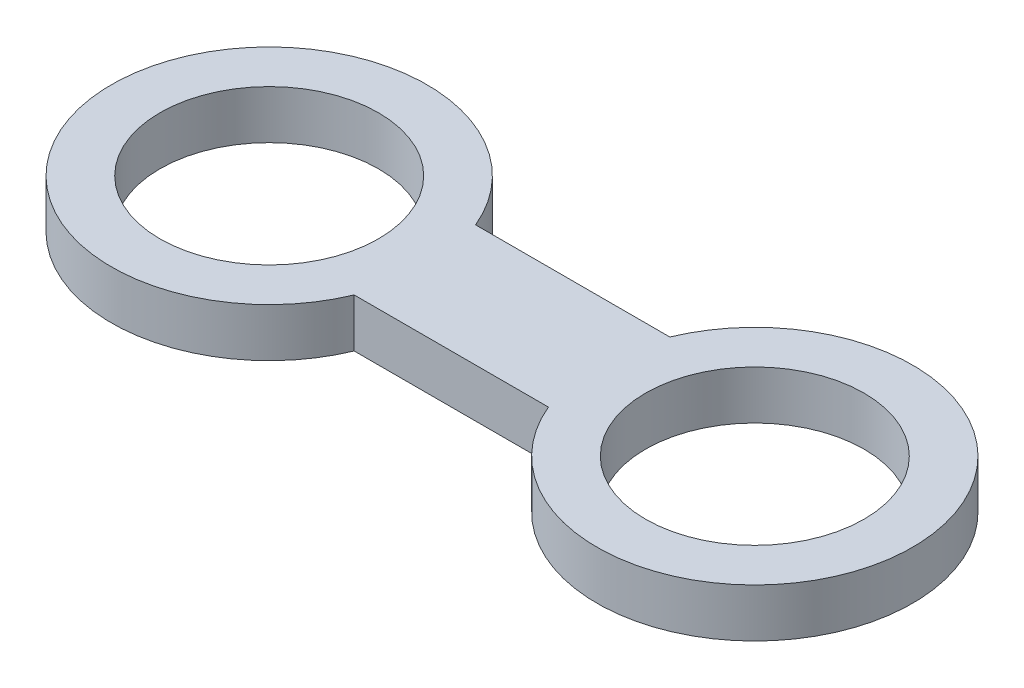
ISO-10303-21;
HEADER;
FILE_DESCRIPTION(('STEP AP214'),'2;1');
FILE_NAME('part.step','',(''),(''),'','','');
FILE_SCHEMA(('AUTOMOTIVE_DESIGN { 1 0 10303 214 1 1 1 1 }'));
ENDSEC;
DATA;
#1=APPLICATION_CONTEXT('core data for automotive mechanical design processes');
#2=APPLICATION_PROTOCOL_DEFINITION('international standard','automotive_design',2000,#1);
#3=PRODUCT_CONTEXT('',#1,'mechanical');
#4=PRODUCT('Part','Part','',(#3));
#5=PRODUCT_RELATED_PRODUCT_CATEGORY('part','',(#4));
#6=PRODUCT_DEFINITION_FORMATION('','',#4);
#7=PRODUCT_DEFINITION_CONTEXT('part definition',#1,'design');
#8=PRODUCT_DEFINITION('design','',#6,#7);
#9=PRODUCT_DEFINITION_SHAPE('','',#8);
#10=(LENGTH_UNIT() NAMED_UNIT(*) SI_UNIT(.MILLI.,.METRE.));
#11=(NAMED_UNIT(*) PLANE_ANGLE_UNIT() SI_UNIT($,.RADIAN.));
#12=(NAMED_UNIT(*) SI_UNIT($,.STERADIAN.) SOLID_ANGLE_UNIT());
#13=UNCERTAINTY_MEASURE_WITH_UNIT(LENGTH_MEASURE(1.E-05),#10,'distance_accuracy_value','');
#14=(GEOMETRIC_REPRESENTATION_CONTEXT(3) GLOBAL_UNCERTAINTY_ASSIGNED_CONTEXT((#13)) GLOBAL_UNIT_ASSIGNED_CONTEXT((#10,
#11,#12)) REPRESENTATION_CONTEXT('',''));
#15=CARTESIAN_POINT('',(0.,0.,0.));
#16=DIRECTION('',(0.,0.,1.));
#17=DIRECTION('',(1.,0.,0.));
#18=AXIS2_PLACEMENT_3D('',#15,#16,#17);
#19=CARTESIAN_POINT('',(20.,-2.,0.));
#20=DIRECTION('',(0.,1.,0.));
#21=DIRECTION('',(0.,0.,1.));
#22=AXIS2_PLACEMENT_3D('',#19,#20,#21);
#23=CYLINDRICAL_SURFACE('',#22,6.50000000000001);
#24=CARTESIAN_POINT('',(20.,0.,0.));
#25=DIRECTION('',(0.,1.,0.));
#26=DIRECTION('',(0.,0.,1.));
#27=AXIS2_PLACEMENT_3D('',#24,#25,#26);
#28=CIRCLE('',#27,6.50000000000001);
#29=CARTESIAN_POINT('',(14.,0.,2.5));
#30=VERTEX_POINT('',#29);
#31=CARTESIAN_POINT('',(14.,0.,-2.5));
#32=VERTEX_POINT('',#31);
#33=EDGE_CURVE('E106',#30,#32,#28,.T.);
#34=ORIENTED_EDGE('',*,*,#33,.F.);
#35=DIRECTION('',(0.,1.,0.));
#36=VECTOR('',#35,1.);
#37=CARTESIAN_POINT('',(14.,-2.,2.5));
#38=LINE('',#37,#36);
#39=CARTESIAN_POINT('',(14.,-2.,2.5));
#40=VERTEX_POINT('',#39);
#41=EDGE_CURVE('E11',#40,#30,#38,.T.);
#42=ORIENTED_EDGE('',*,*,#41,.F.);
#43=CARTESIAN_POINT('',(20.,-2.,0.));
#44=DIRECTION('',(0.,1.,0.));
#45=DIRECTION('',(0.,0.,1.));
#46=AXIS2_PLACEMENT_3D('',#43,#44,#45);
#47=CIRCLE('',#46,6.50000000000001);
#48=CARTESIAN_POINT('',(14.,-2.,-2.5));
#49=VERTEX_POINT('',#48);
#50=EDGE_CURVE('E99',#40,#49,#47,.T.);
#51=ORIENTED_EDGE('',*,*,#50,.T.);
#52=DIRECTION('',(0.,1.,0.));
#53=VECTOR('',#52,1.);
#54=CARTESIAN_POINT('',(14.,-2.,-2.5));
#55=LINE('',#54,#53);
#56=EDGE_CURVE('E44',#49,#32,#55,.T.);
#57=ORIENTED_EDGE('',*,*,#56,.T.);
#58=EDGE_LOOP('',(#34,#42,#51,#57));
#59=FACE_BOUND('',#58,.T.);
#60=ADVANCED_FACE('F41',(#59),#23,.T.);
#61=CARTESIAN_POINT('',(6.,-2.,2.5));
#62=DIRECTION('',(0.,0.,1.));
#63=DIRECTION('',(1.,0.,0.));
#64=AXIS2_PLACEMENT_3D('',#61,#62,#63);
#65=PLANE('',#64);
#66=DIRECTION('',(1.,0.,0.));
#67=VECTOR('',#66,1.);
#68=CARTESIAN_POINT('',(6.,0.,2.5));
#69=LINE('',#68,#67);
#70=CARTESIAN_POINT('',(6.,0.,2.5));
#71=VERTEX_POINT('',#70);
#72=EDGE_CURVE('E101',#71,#30,#69,.T.);
#73=ORIENTED_EDGE('',*,*,#72,.F.);
#74=DIRECTION('',(0.,1.,0.));
#75=VECTOR('',#74,1.);
#76=CARTESIAN_POINT('',(6.,-2.,2.5));
#77=LINE('',#76,#75);
#78=CARTESIAN_POINT('',(6.,-2.,2.5));
#79=VERTEX_POINT('',#78);
#80=EDGE_CURVE('E50',#79,#71,#77,.T.);
#81=ORIENTED_EDGE('',*,*,#80,.F.);
#82=DIRECTION('',(1.,0.,0.));
#83=VECTOR('',#82,1.);
#84=CARTESIAN_POINT('',(6.,-2.,2.5));
#85=LINE('',#84,#83);
#86=EDGE_CURVE('E96',#79,#40,#85,.T.);
#87=ORIENTED_EDGE('',*,*,#86,.T.);
#88=ORIENTED_EDGE('',*,*,#41,.T.);
#89=EDGE_LOOP('',(#73,#81,#87,#88));
#90=FACE_BOUND('',#89,.T.);
#91=ADVANCED_FACE('F117',(#90),#65,.T.);
#92=CARTESIAN_POINT('',(0.,-2.,0.));
#93=DIRECTION('',(0.,1.,0.));
#94=DIRECTION('',(0.,0.,1.));
#95=AXIS2_PLACEMENT_3D('',#92,#93,#94);
#96=CYLINDRICAL_SURFACE('',#95,6.5);
#97=CARTESIAN_POINT('',(0.,0.,0.));
#98=DIRECTION('',(0.,1.,0.));
#99=DIRECTION('',(0.,0.,1.));
#100=AXIS2_PLACEMENT_3D('',#97,#98,#99);
#101=CIRCLE('',#100,6.5);
#102=CARTESIAN_POINT('',(6.,0.,-2.5));
#103=VERTEX_POINT('',#102);
#104=EDGE_CURVE('E91',#103,#71,#101,.T.);
#105=ORIENTED_EDGE('',*,*,#104,.F.);
#106=DIRECTION('',(0.,1.,0.));
#107=VECTOR('',#106,1.);
#108=CARTESIAN_POINT('',(6.,-2.,-2.5));
#109=LINE('',#108,#107);
#110=CARTESIAN_POINT('',(6.,-2.,-2.5));
#111=VERTEX_POINT('',#110);
#112=EDGE_CURVE('E86',#111,#103,#109,.T.);
#113=ORIENTED_EDGE('',*,*,#112,.F.);
#114=CARTESIAN_POINT('',(0.,-2.,0.));
#115=DIRECTION('',(0.,1.,0.));
#116=DIRECTION('',(0.,0.,1.));
#117=AXIS2_PLACEMENT_3D('',#114,#115,#116);
#118=CIRCLE('',#117,6.5);
#119=EDGE_CURVE('E89',#111,#79,#118,.T.);
#120=ORIENTED_EDGE('',*,*,#119,.T.);
#121=ORIENTED_EDGE('',*,*,#80,.T.);
#122=EDGE_LOOP('',(#105,#113,#120,#121));
#123=FACE_BOUND('',#122,.T.);
#124=ADVANCED_FACE('F88',(#123),#96,.T.);
#125=CARTESIAN_POINT('',(6.,-2.,-2.5));
#126=DIRECTION('',(0.,0.,-1.));
#127=DIRECTION('',(-1.,0.,0.));
#128=AXIS2_PLACEMENT_3D('',#125,#126,#127);
#129=PLANE('',#128);
#130=DIRECTION('',(-1.,0.,0.));
#131=VECTOR('',#130,1.);
#132=CARTESIAN_POINT('',(6.,0.,-2.5));
#133=LINE('',#132,#131);
#134=EDGE_CURVE('E109',#32,#103,#133,.T.);
#135=ORIENTED_EDGE('',*,*,#134,.F.);
#136=ORIENTED_EDGE('',*,*,#56,.F.);
#137=DIRECTION('',(-1.,0.,0.));
#138=VECTOR('',#137,1.);
#139=CARTESIAN_POINT('',(6.,-2.,-2.5));
#140=LINE('',#139,#138);
#141=EDGE_CURVE('E95',#49,#111,#140,.T.);
#142=ORIENTED_EDGE('',*,*,#141,.T.);
#143=ORIENTED_EDGE('',*,*,#112,.T.);
#144=EDGE_LOOP('',(#135,#136,#142,#143));
#145=FACE_BOUND('',#144,.T.);
#146=ADVANCED_FACE('F98',(#145),#129,.T.);
#147=CARTESIAN_POINT('',(20.,-2.,0.));
#148=DIRECTION('',(0.,1.,0.));
#149=DIRECTION('',(0.,0.,1.));
#150=AXIS2_PLACEMENT_3D('',#147,#148,#149);
#151=PLANE('',#150);
#152=CARTESIAN_POINT('',(0.,-2.,0.));
#153=DIRECTION('',(0.,1.,0.));
#154=DIRECTION('',(0.,0.,1.));
#155=AXIS2_PLACEMENT_3D('',#152,#153,#154);
#156=CIRCLE('',#155,4.5);
#157=CARTESIAN_POINT('',(0.,-2.,4.5));
#158=VERTEX_POINT('',#157);
#159=EDGE_CURVE('E110',#158,#158,#156,.T.);
#160=ORIENTED_EDGE('',*,*,#159,.T.);
#161=EDGE_LOOP('',(#160));
#162=FACE_BOUND('',#161,.T.);
#163=CARTESIAN_POINT('',(20.,-2.,0.));
#164=DIRECTION('',(0.,1.,0.));
#165=DIRECTION('',(0.,0.,1.));
#166=AXIS2_PLACEMENT_3D('',#163,#164,#165);
#167=CIRCLE('',#166,4.5);
#168=CARTESIAN_POINT('',(20.,-2.,4.5));
#169=VERTEX_POINT('',#168);
#170=EDGE_CURVE('E157',#169,#169,#167,.T.);
#171=ORIENTED_EDGE('',*,*,#170,.T.);
#172=EDGE_LOOP('',(#171));
#173=FACE_BOUND('',#172,.T.);
#174=ORIENTED_EDGE('',*,*,#50,.F.);
#175=ORIENTED_EDGE('',*,*,#86,.F.);
#176=ORIENTED_EDGE('',*,*,#119,.F.);
#177=ORIENTED_EDGE('',*,*,#141,.F.);
#178=EDGE_LOOP('',(#174,#175,#176,#177));
#179=FACE_BOUND('',#178,.T.);
#180=ADVANCED_FACE('F94',(#162,#173,#179),#151,.F.);
#181=CARTESIAN_POINT('',(20.,0.,0.));
#182=DIRECTION('',(0.,1.,0.));
#183=DIRECTION('',(0.,0.,1.));
#184=AXIS2_PLACEMENT_3D('',#181,#182,#183);
#185=PLANE('',#184);
#186=CARTESIAN_POINT('',(0.,0.,0.));
#187=DIRECTION('',(0.,1.,0.));
#188=DIRECTION('',(0.,0.,1.));
#189=AXIS2_PLACEMENT_3D('',#186,#187,#188);
#190=CIRCLE('',#189,4.5);
#191=CARTESIAN_POINT('',(0.,0.,4.5));
#192=VERTEX_POINT('',#191);
#193=EDGE_CURVE('E152',#192,#192,#190,.T.);
#194=ORIENTED_EDGE('',*,*,#193,.F.);
#195=EDGE_LOOP('',(#194));
#196=FACE_BOUND('',#195,.T.);
#197=CARTESIAN_POINT('',(20.,0.,0.));
#198=DIRECTION('',(0.,1.,0.));
#199=DIRECTION('',(0.,0.,1.));
#200=AXIS2_PLACEMENT_3D('',#197,#198,#199);
#201=CIRCLE('',#200,4.5);
#202=CARTESIAN_POINT('',(20.,0.,4.5));
#203=VERTEX_POINT('',#202);
#204=EDGE_CURVE('E153',#203,#203,#201,.T.);
#205=ORIENTED_EDGE('',*,*,#204,.F.);
#206=EDGE_LOOP('',(#205));
#207=FACE_BOUND('',#206,.T.);
#208=ORIENTED_EDGE('',*,*,#33,.T.);
#209=ORIENTED_EDGE('',*,*,#134,.T.);
#210=ORIENTED_EDGE('',*,*,#104,.T.);
#211=ORIENTED_EDGE('',*,*,#72,.T.);
#212=EDGE_LOOP('',(#208,#209,#210,#211));
#213=FACE_BOUND('',#212,.T.);
#214=ADVANCED_FACE('F116',(#196,#207,#213),#185,.T.);
#215=CARTESIAN_POINT('',(20.,-2.,0.));
#216=DIRECTION('',(0.,1.,0.));
#217=DIRECTION('',(0.,0.,1.));
#218=AXIS2_PLACEMENT_3D('',#215,#216,#217);
#219=CYLINDRICAL_SURFACE('',#218,4.5);
#220=ORIENTED_EDGE('',*,*,#170,.F.);
#221=EDGE_LOOP('',(#220));
#222=FACE_BOUND('',#221,.T.);
#223=ORIENTED_EDGE('',*,*,#204,.T.);
#224=EDGE_LOOP('',(#223));
#225=FACE_BOUND('',#224,.T.);
#226=ADVANCED_FACE('F135',(#222,#225),#219,.F.);
#227=CARTESIAN_POINT('',(0.,-2.,0.));
#228=DIRECTION('',(0.,1.,0.));
#229=DIRECTION('',(0.,0.,1.));
#230=AXIS2_PLACEMENT_3D('',#227,#228,#229);
#231=CYLINDRICAL_SURFACE('',#230,4.5);
#232=ORIENTED_EDGE('',*,*,#159,.F.);
#233=EDGE_LOOP('',(#232));
#234=FACE_BOUND('',#233,.T.);
#235=ORIENTED_EDGE('',*,*,#193,.T.);
#236=EDGE_LOOP('',(#235));
#237=FACE_BOUND('',#236,.T.);
#238=ADVANCED_FACE('F142',(#234,#237),#231,.F.);
#239=CLOSED_SHELL('',(#60,#91,#124,#146,#180,#214,#226,#238));
#240=MANIFOLD_SOLID_BREP('B2',#239);
#241=ADVANCED_BREP_SHAPE_REPRESENTATION('',(#18,#240),#14);
#242=SHAPE_DEFINITION_REPRESENTATION(#9,#241);
ENDSEC;
END-ISO-10303-21;
